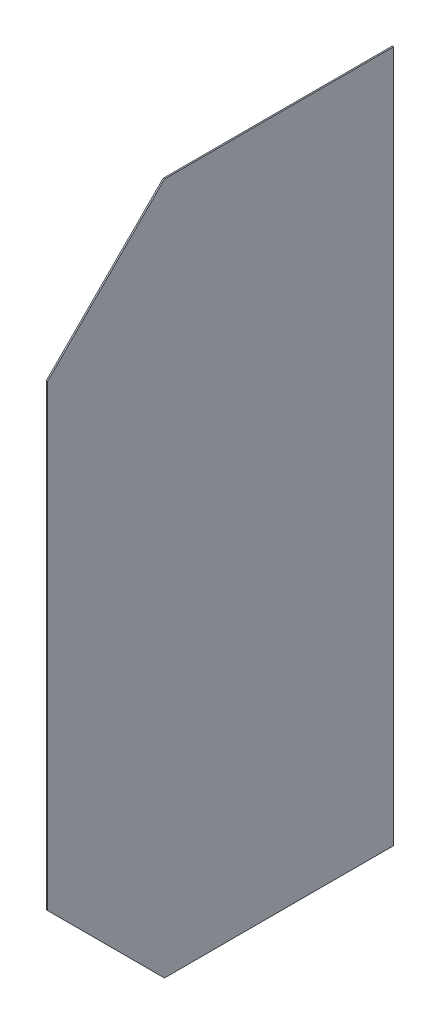
ISO-10303-21;
HEADER;
FILE_DESCRIPTION(('STEP AP214'),'2;1');
FILE_NAME('part.step','',(''),(''),'','','');
FILE_SCHEMA(('AUTOMOTIVE_DESIGN { 1 0 10303 214 1 1 1 1 }'));
ENDSEC;
DATA;
#1=APPLICATION_CONTEXT('core data for automotive mechanical design processes');
#2=APPLICATION_PROTOCOL_DEFINITION('international standard','automotive_design',2000,#1);
#3=PRODUCT_CONTEXT('',#1,'mechanical');
#4=PRODUCT('Part','Part','',(#3));
#5=PRODUCT_RELATED_PRODUCT_CATEGORY('part','',(#4));
#6=PRODUCT_DEFINITION_FORMATION('','',#4);
#7=PRODUCT_DEFINITION_CONTEXT('part definition',#1,'design');
#8=PRODUCT_DEFINITION('design','',#6,#7);
#9=PRODUCT_DEFINITION_SHAPE('','',#8);
#10=(LENGTH_UNIT() NAMED_UNIT(*) SI_UNIT(.MILLI.,.METRE.));
#11=(NAMED_UNIT(*) PLANE_ANGLE_UNIT() SI_UNIT($,.RADIAN.));
#12=(NAMED_UNIT(*) SI_UNIT($,.STERADIAN.) SOLID_ANGLE_UNIT());
#13=UNCERTAINTY_MEASURE_WITH_UNIT(LENGTH_MEASURE(1.E-05),#10,'distance_accuracy_value','');
#14=(GEOMETRIC_REPRESENTATION_CONTEXT(3) GLOBAL_UNCERTAINTY_ASSIGNED_CONTEXT((#13)) GLOBAL_UNIT_ASSIGNED_CONTEXT((#10,
#11,#12)) REPRESENTATION_CONTEXT('',''));
#15=CARTESIAN_POINT('',(0.,0.,0.));
#16=DIRECTION('',(0.,0.,1.));
#17=DIRECTION('',(1.,0.,0.));
#18=AXIS2_PLACEMENT_3D('',#15,#16,#17);
#19=CARTESIAN_POINT('',(0.,40.,0.));
#20=DIRECTION('',(0.,1.,0.));
#21=DIRECTION('',(0.,0.,1.));
#22=AXIS2_PLACEMENT_3D('',#19,#20,#21);
#23=PLANE('',#22);
#24=DIRECTION('',(0.,0.,-1.));
#25=VECTOR('',#24,1.);
#26=CARTESIAN_POINT('',(0.,40.,0.));
#27=LINE('',#26,#25);
#28=CARTESIAN_POINT('',(0.,40.,-20.));
#29=VERTEX_POINT('',#28);
#30=CARTESIAN_POINT('',(0.,40.0000000007425,6.50000000074246));
#31=VERTEX_POINT('',#30);
#32=EDGE_CURVE('E109',#29,#31,#27,.F.);
#33=ORIENTED_EDGE('',*,*,#32,.T.);
#34=DIRECTION('',(1.,0.,0.));
#35=VECTOR('',#34,1.);
#36=CARTESIAN_POINT('',(0.,40.0000000029699,6.50000000296985));
#37=LINE('',#36,#35);
#38=CARTESIAN_POINT('',(0.15,40.0000000014849,6.50000000148493));
#39=VERTEX_POINT('',#38);
#40=EDGE_CURVE('E101',#31,#39,#37,.T.);
#41=ORIENTED_EDGE('',*,*,#40,.T.);
#42=DIRECTION('',(0.,0.,-1.));
#43=VECTOR('',#42,1.);
#44=CARTESIAN_POINT('',(0.15,40.,0.));
#45=LINE('',#44,#43);
#46=CARTESIAN_POINT('',(0.15,40.,-20.));
#47=VERTEX_POINT('',#46);
#48=EDGE_CURVE('E108',#39,#47,#45,.T.);
#49=ORIENTED_EDGE('',*,*,#48,.T.);
#50=DIRECTION('',(1.,0.,0.));
#51=VECTOR('',#50,1.);
#52=CARTESIAN_POINT('',(0.,40.,-20.));
#53=LINE('',#52,#51);
#54=EDGE_CURVE('E20',#29,#47,#53,.T.);
#55=ORIENTED_EDGE('',*,*,#54,.F.);
#56=EDGE_LOOP('',(#33,#41,#49,#55));
#57=FACE_BOUND('',#56,.T.);
#58=ADVANCED_FACE('F17',(#57),#23,.T.);
#59=CARTESIAN_POINT('',(0.,23.2500000029698,23.2500000029698));
#60=DIRECTION('',(0.,0.707106781186548,0.707106781186548));
#61=DIRECTION('',(0.,-0.707106781186548,0.707106781186548));
#62=AXIS2_PLACEMENT_3D('',#59,#60,#61);
#63=PLANE('',#62);
#64=DIRECTION('',(0.,-0.707106781186548,0.707106781186547));
#65=VECTOR('',#64,1.);
#66=CARTESIAN_POINT('',(0.,40.,6.5));
#67=LINE('',#66,#65);
#68=CARTESIAN_POINT('',(0.,26.5000000014849,20.0000000014849));
#69=VERTEX_POINT('',#68);
#70=EDGE_CURVE('E118',#31,#69,#67,.T.);
#71=ORIENTED_EDGE('',*,*,#70,.T.);
#72=DIRECTION('',(1.,0.,0.));
#73=VECTOR('',#72,1.);
#74=CARTESIAN_POINT('',(0.,26.5,20.));
#75=LINE('',#74,#73);
#76=CARTESIAN_POINT('',(0.15,26.5000000007425,20.0000000007425));
#77=VERTEX_POINT('',#76);
#78=EDGE_CURVE('E100',#69,#77,#75,.T.);
#79=ORIENTED_EDGE('',*,*,#78,.T.);
#80=DIRECTION('',(0.,0.707106781186548,-0.707106781186547));
#81=VECTOR('',#80,1.);
#82=CARTESIAN_POINT('',(0.15,26.5,20.));
#83=LINE('',#82,#81);
#84=EDGE_CURVE('E94',#77,#39,#83,.T.);
#85=ORIENTED_EDGE('',*,*,#84,.T.);
#86=ORIENTED_EDGE('',*,*,#40,.F.);
#87=EDGE_LOOP('',(#71,#79,#85,#86));
#88=FACE_BOUND('',#87,.T.);
#89=ADVANCED_FACE('F121',(#88),#63,.T.);
#90=CARTESIAN_POINT('',(0.,0.,20.));
#91=DIRECTION('',(0.,0.,1.));
#92=DIRECTION('',(1.,0.,0.));
#93=AXIS2_PLACEMENT_3D('',#90,#91,#92);
#94=PLANE('',#93);
#95=DIRECTION('',(0.,1.,0.));
#96=VECTOR('',#95,1.);
#97=CARTESIAN_POINT('',(0.,0.,20.));
#98=LINE('',#97,#96);
#99=CARTESIAN_POINT('',(0.,-26.5000000007425,20.0000000007425));
#100=VERTEX_POINT('',#99);
#101=EDGE_CURVE('E116',#69,#100,#98,.F.);
#102=ORIENTED_EDGE('',*,*,#101,.T.);
#103=DIRECTION('',(1.,0.,0.));
#104=VECTOR('',#103,1.);
#105=CARTESIAN_POINT('',(0.,-26.5000000029698,20.0000000029699));
#106=LINE('',#105,#104);
#107=CARTESIAN_POINT('',(0.15,-26.5000000014849,20.0000000014849));
#108=VERTEX_POINT('',#107);
#109=EDGE_CURVE('E67',#100,#108,#106,.T.);
#110=ORIENTED_EDGE('',*,*,#109,.T.);
#111=DIRECTION('',(0.,1.,0.));
#112=VECTOR('',#111,1.);
#113=CARTESIAN_POINT('',(0.15,0.,20.));
#114=LINE('',#113,#112);
#115=EDGE_CURVE('E92',#108,#77,#114,.T.);
#116=ORIENTED_EDGE('',*,*,#115,.T.);
#117=ORIENTED_EDGE('',*,*,#78,.F.);
#118=EDGE_LOOP('',(#102,#110,#116,#117));
#119=FACE_BOUND('',#118,.T.);
#120=ADVANCED_FACE('F125',(#119),#94,.T.);
#121=CARTESIAN_POINT('',(0.,-23.2500000029698,23.2500000029698));
#122=DIRECTION('',(0.,-0.707106781186548,0.707106781186548));
#123=DIRECTION('',(0.,-0.707106781186548,-0.707106781186548));
#124=AXIS2_PLACEMENT_3D('',#121,#122,#123);
#125=PLANE('',#124);
#126=DIRECTION('',(0.,-0.707106781186548,-0.707106781186547));
#127=VECTOR('',#126,1.);
#128=CARTESIAN_POINT('',(0.,-26.5,20.));
#129=LINE('',#128,#127);
#130=CARTESIAN_POINT('',(0.,-40.0000000014849,6.50000000148493));
#131=VERTEX_POINT('',#130);
#132=EDGE_CURVE('E79',#100,#131,#129,.T.);
#133=ORIENTED_EDGE('',*,*,#132,.T.);
#134=DIRECTION('',(1.,0.,0.));
#135=VECTOR('',#134,1.);
#136=CARTESIAN_POINT('',(0.,-40.,6.5));
#137=LINE('',#136,#135);
#138=CARTESIAN_POINT('',(0.15,-40.0000000007425,6.50000000074246));
#139=VERTEX_POINT('',#138);
#140=EDGE_CURVE('E72',#131,#139,#137,.T.);
#141=ORIENTED_EDGE('',*,*,#140,.T.);
#142=DIRECTION('',(0.,0.707106781186548,0.707106781186547));
#143=VECTOR('',#142,1.);
#144=CARTESIAN_POINT('',(0.15,-40.,6.5));
#145=LINE('',#144,#143);
#146=EDGE_CURVE('E76',#139,#108,#145,.T.);
#147=ORIENTED_EDGE('',*,*,#146,.T.);
#148=ORIENTED_EDGE('',*,*,#109,.F.);
#149=EDGE_LOOP('',(#133,#141,#147,#148));
#150=FACE_BOUND('',#149,.T.);
#151=ADVANCED_FACE('F74',(#150),#125,.T.);
#152=CARTESIAN_POINT('',(0.,-40.,0.));
#153=DIRECTION('',(0.,-1.,0.));
#154=DIRECTION('',(0.,0.,-1.));
#155=AXIS2_PLACEMENT_3D('',#152,#153,#154);
#156=PLANE('',#155);
#157=DIRECTION('',(0.,0.,-1.));
#158=VECTOR('',#157,1.);
#159=CARTESIAN_POINT('',(0.,-40.,0.));
#160=LINE('',#159,#158);
#161=CARTESIAN_POINT('',(0.,-40.,-20.));
#162=VERTEX_POINT('',#161);
#163=EDGE_CURVE('E111',#131,#162,#160,.T.);
#164=ORIENTED_EDGE('',*,*,#163,.T.);
#165=DIRECTION('',(1.,0.,0.));
#166=VECTOR('',#165,1.);
#167=CARTESIAN_POINT('',(0.,-40.,-20.));
#168=LINE('',#167,#166);
#169=CARTESIAN_POINT('',(0.15,-40.,-20.));
#170=VERTEX_POINT('',#169);
#171=EDGE_CURVE('E35',#170,#162,#168,.F.);
#172=ORIENTED_EDGE('',*,*,#171,.F.);
#173=DIRECTION('',(0.,0.,-1.));
#174=VECTOR('',#173,1.);
#175=CARTESIAN_POINT('',(0.15,-40.,0.));
#176=LINE('',#175,#174);
#177=EDGE_CURVE('E82',#170,#139,#176,.F.);
#178=ORIENTED_EDGE('',*,*,#177,.T.);
#179=ORIENTED_EDGE('',*,*,#140,.F.);
#180=EDGE_LOOP('',(#164,#172,#178,#179));
#181=FACE_BOUND('',#180,.T.);
#182=ADVANCED_FACE('F85',(#181),#156,.T.);
#183=CARTESIAN_POINT('',(0.15,0.,0.));
#184=DIRECTION('',(1.,0.,0.));
#185=DIRECTION('',(0.,0.,-1.));
#186=AXIS2_PLACEMENT_3D('',#183,#184,#185);
#187=PLANE('',#186);
#188=ORIENTED_EDGE('',*,*,#48,.F.);
#189=ORIENTED_EDGE('',*,*,#84,.F.);
#190=ORIENTED_EDGE('',*,*,#115,.F.);
#191=ORIENTED_EDGE('',*,*,#146,.F.);
#192=ORIENTED_EDGE('',*,*,#177,.F.);
#193=DIRECTION('',(0.,1.,0.));
#194=VECTOR('',#193,1.);
#195=CARTESIAN_POINT('',(0.15,0.,-20.));
#196=LINE('',#195,#194);
#197=EDGE_CURVE('E26',#170,#47,#196,.T.);
#198=ORIENTED_EDGE('',*,*,#197,.T.);
#199=EDGE_LOOP('',(#188,#189,#190,#191,#192,#198));
#200=FACE_BOUND('',#199,.T.);
#201=ADVANCED_FACE('F90',(#200),#187,.T.);
#202=CARTESIAN_POINT('',(0.,0.,0.));
#203=DIRECTION('',(1.,0.,0.));
#204=DIRECTION('',(0.,0.,-1.));
#205=AXIS2_PLACEMENT_3D('',#202,#203,#204);
#206=PLANE('',#205);
#207=ORIENTED_EDGE('',*,*,#132,.F.);
#208=ORIENTED_EDGE('',*,*,#101,.F.);
#209=ORIENTED_EDGE('',*,*,#70,.F.);
#210=ORIENTED_EDGE('',*,*,#32,.F.);
#211=DIRECTION('',(0.,1.,0.));
#212=VECTOR('',#211,1.);
#213=CARTESIAN_POINT('',(0.,0.,-20.));
#214=LINE('',#213,#212);
#215=EDGE_CURVE('E11',#29,#162,#214,.F.);
#216=ORIENTED_EDGE('',*,*,#215,.T.);
#217=ORIENTED_EDGE('',*,*,#163,.F.);
#218=EDGE_LOOP('',(#207,#208,#209,#210,#216,#217));
#219=FACE_BOUND('',#218,.T.);
#220=ADVANCED_FACE('F135',(#219),#206,.F.);
#221=CARTESIAN_POINT('',(0.,0.,-20.));
#222=DIRECTION('',(0.,0.,-1.));
#223=DIRECTION('',(-1.,0.,0.));
#224=AXIS2_PLACEMENT_3D('',#221,#222,#223);
#225=PLANE('',#224);
#226=ORIENTED_EDGE('',*,*,#215,.F.);
#227=ORIENTED_EDGE('',*,*,#54,.T.);
#228=ORIENTED_EDGE('',*,*,#197,.F.);
#229=ORIENTED_EDGE('',*,*,#171,.T.);
#230=EDGE_LOOP('',(#226,#227,#228,#229));
#231=FACE_BOUND('',#230,.T.);
#232=ADVANCED_FACE('F106',(#231),#225,.T.);
#233=CLOSED_SHELL('',(#58,#89,#120,#151,#182,#201,#220,#232));
#234=MANIFOLD_SOLID_BREP('B1',#233);
#235=ADVANCED_BREP_SHAPE_REPRESENTATION('',(#18,#234),#14);
#236=SHAPE_DEFINITION_REPRESENTATION(#9,#235);
ENDSEC;
END-ISO-10303-21;
